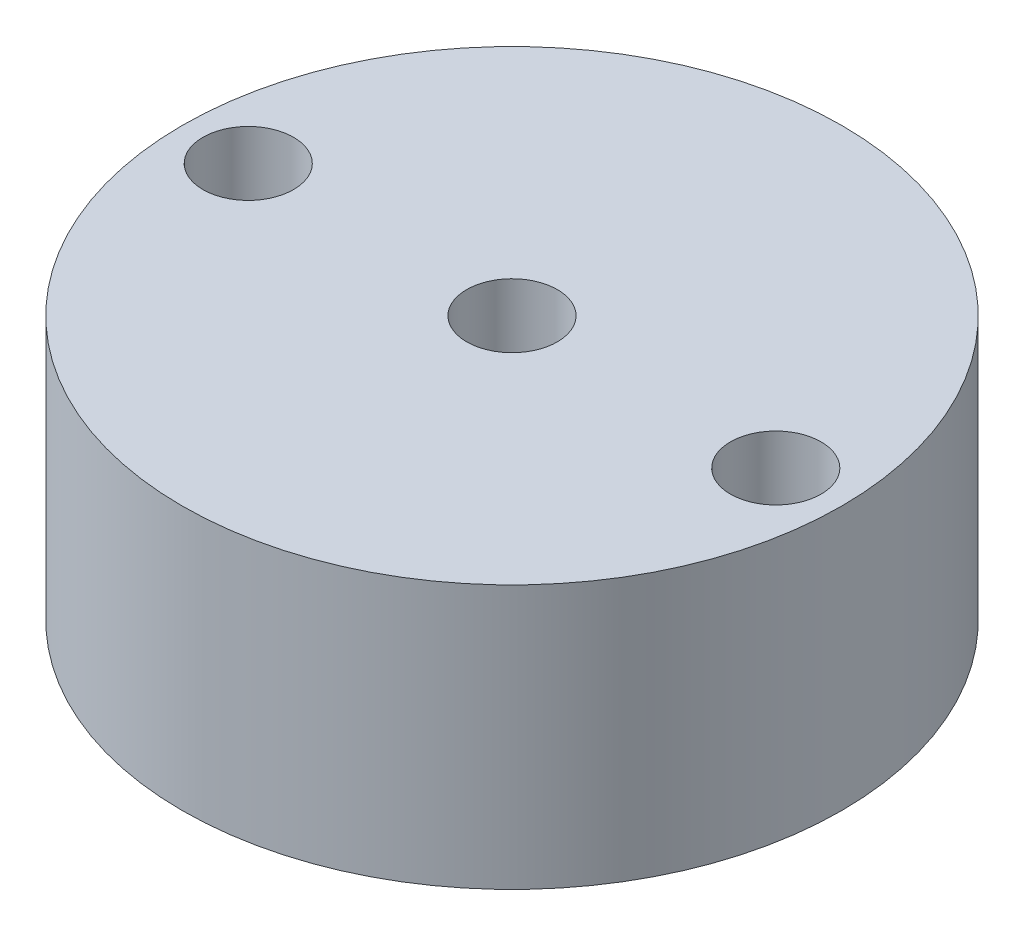
ISO-10303-21;
HEADER;
FILE_DESCRIPTION(('STEP AP214'),'2;1');
FILE_NAME('part.step','',(''),(''),'','','');
FILE_SCHEMA(('AUTOMOTIVE_DESIGN { 1 0 10303 214 1 1 1 1 }'));
ENDSEC;
DATA;
#1=APPLICATION_CONTEXT('core data for automotive mechanical design processes');
#2=APPLICATION_PROTOCOL_DEFINITION('international standard','automotive_design',2000,#1);
#3=PRODUCT_CONTEXT('',#1,'mechanical');
#4=PRODUCT('Part','Part','',(#3));
#5=PRODUCT_RELATED_PRODUCT_CATEGORY('part','',(#4));
#6=PRODUCT_DEFINITION_FORMATION('','',#4);
#7=PRODUCT_DEFINITION_CONTEXT('part definition',#1,'design');
#8=PRODUCT_DEFINITION('design','',#6,#7);
#9=PRODUCT_DEFINITION_SHAPE('','',#8);
#10=(LENGTH_UNIT() NAMED_UNIT(*) SI_UNIT(.MILLI.,.METRE.));
#11=(NAMED_UNIT(*) PLANE_ANGLE_UNIT() SI_UNIT($,.RADIAN.));
#12=(NAMED_UNIT(*) SI_UNIT($,.STERADIAN.) SOLID_ANGLE_UNIT());
#13=UNCERTAINTY_MEASURE_WITH_UNIT(LENGTH_MEASURE(1.E-05),#10,'distance_accuracy_value','');
#14=(GEOMETRIC_REPRESENTATION_CONTEXT(3) GLOBAL_UNCERTAINTY_ASSIGNED_CONTEXT((#13)) GLOBAL_UNIT_ASSIGNED_CONTEXT((#10,
#11,#12)) REPRESENTATION_CONTEXT('',''));
#15=CARTESIAN_POINT('',(0.,0.,0.));
#16=DIRECTION('',(0.,0.,1.));
#17=DIRECTION('',(1.,0.,0.));
#18=AXIS2_PLACEMENT_3D('',#15,#16,#17);
#19=CARTESIAN_POINT('',(0.,12.7,0.));
#20=DIRECTION('',(0.,1.,0.));
#21=DIRECTION('',(0.,0.,1.));
#22=AXIS2_PLACEMENT_3D('',#19,#20,#21);
#23=PLANE('',#22);
#24=CARTESIAN_POINT('',(12.7,12.7,0.));
#25=DIRECTION('',(0.,1.,0.));
#26=DIRECTION('',(0.,0.,1.));
#27=AXIS2_PLACEMENT_3D('',#24,#25,#26);
#28=CIRCLE('',#27,2.1828125);
#29=CARTESIAN_POINT('',(12.7,12.7,2.1828125));
#30=VERTEX_POINT('',#29);
#31=EDGE_CURVE('E56',#30,#30,#28,.T.);
#32=ORIENTED_EDGE('',*,*,#31,.F.);
#33=EDGE_LOOP('',(#32));
#34=FACE_BOUND('',#33,.T.);
#35=CARTESIAN_POINT('',(0.,12.7,0.));
#36=DIRECTION('',(0.,1.,0.));
#37=DIRECTION('',(0.,0.,1.));
#38=AXIS2_PLACEMENT_3D('',#35,#36,#37);
#39=CIRCLE('',#38,15.875);
#40=CARTESIAN_POINT('',(0.,12.7,15.875));
#41=VERTEX_POINT('',#40);
#42=EDGE_CURVE('E10',#41,#41,#39,.T.);
#43=ORIENTED_EDGE('',*,*,#42,.T.);
#44=EDGE_LOOP('',(#43));
#45=FACE_BOUND('',#44,.T.);
#46=CARTESIAN_POINT('',(0.,12.7,0.));
#47=DIRECTION('',(0.,1.,0.));
#48=DIRECTION('',(0.,0.,1.));
#49=AXIS2_PLACEMENT_3D('',#46,#47,#48);
#50=CIRCLE('',#49,2.1828125);
#51=CARTESIAN_POINT('',(0.,12.7,2.1828125));
#52=VERTEX_POINT('',#51);
#53=EDGE_CURVE('E50',#52,#52,#50,.T.);
#54=ORIENTED_EDGE('',*,*,#53,.F.);
#55=EDGE_LOOP('',(#54));
#56=FACE_BOUND('',#55,.T.);
#57=CARTESIAN_POINT('',(-12.7,12.7,0.));
#58=DIRECTION('',(0.,1.,0.));
#59=DIRECTION('',(0.,0.,1.));
#60=AXIS2_PLACEMENT_3D('',#57,#58,#59);
#61=CIRCLE('',#60,2.1828125);
#62=CARTESIAN_POINT('',(-12.7,12.7,2.1828125));
#63=VERTEX_POINT('',#62);
#64=EDGE_CURVE('E64',#63,#63,#61,.T.);
#65=ORIENTED_EDGE('',*,*,#64,.F.);
#66=EDGE_LOOP('',(#65));
#67=FACE_BOUND('',#66,.T.);
#68=ADVANCED_FACE('F37',(#34,#45,#56,#67),#23,.T.);
#69=CARTESIAN_POINT('',(0.,0.,0.));
#70=DIRECTION('',(0.,1.,0.));
#71=DIRECTION('',(0.,0.,1.));
#72=AXIS2_PLACEMENT_3D('',#69,#70,#71);
#73=PLANE('',#72);
#74=CARTESIAN_POINT('',(0.,0.,0.));
#75=DIRECTION('',(0.,1.,0.));
#76=DIRECTION('',(0.,0.,1.));
#77=AXIS2_PLACEMENT_3D('',#74,#75,#76);
#78=CIRCLE('',#77,15.875);
#79=CARTESIAN_POINT('',(0.,0.,15.875));
#80=VERTEX_POINT('',#79);
#81=EDGE_CURVE('E41',#80,#80,#78,.T.);
#82=ORIENTED_EDGE('',*,*,#81,.F.);
#83=EDGE_LOOP('',(#82));
#84=FACE_BOUND('',#83,.T.);
#85=CARTESIAN_POINT('',(0.,0.,0.));
#86=DIRECTION('',(0.,1.,0.));
#87=DIRECTION('',(0.,0.,1.));
#88=AXIS2_PLACEMENT_3D('',#85,#86,#87);
#89=CIRCLE('',#88,2.1828125);
#90=CARTESIAN_POINT('',(0.,0.,2.1828125));
#91=VERTEX_POINT('',#90);
#92=EDGE_CURVE('E52',#91,#91,#89,.T.);
#93=ORIENTED_EDGE('',*,*,#92,.T.);
#94=EDGE_LOOP('',(#93));
#95=FACE_BOUND('',#94,.T.);
#96=CARTESIAN_POINT('',(12.7,0.,0.));
#97=DIRECTION('',(0.,1.,0.));
#98=DIRECTION('',(0.,0.,1.));
#99=AXIS2_PLACEMENT_3D('',#96,#97,#98);
#100=CIRCLE('',#99,2.1828125);
#101=CARTESIAN_POINT('',(12.7,0.,2.1828125));
#102=VERTEX_POINT('',#101);
#103=EDGE_CURVE('E60',#102,#102,#100,.T.);
#104=ORIENTED_EDGE('',*,*,#103,.T.);
#105=EDGE_LOOP('',(#104));
#106=FACE_BOUND('',#105,.T.);
#107=CARTESIAN_POINT('',(-12.7,0.,0.));
#108=DIRECTION('',(0.,1.,0.));
#109=DIRECTION('',(0.,0.,1.));
#110=AXIS2_PLACEMENT_3D('',#107,#108,#109);
#111=CIRCLE('',#110,2.1828125);
#112=CARTESIAN_POINT('',(-12.7,0.,2.1828125));
#113=VERTEX_POINT('',#112);
#114=EDGE_CURVE('E68',#113,#113,#111,.T.);
#115=ORIENTED_EDGE('',*,*,#114,.T.);
#116=EDGE_LOOP('',(#115));
#117=FACE_BOUND('',#116,.T.);
#118=ADVANCED_FACE('F80',(#84,#95,#106,#117),#73,.F.);
#119=CARTESIAN_POINT('',(0.,12.7,0.));
#120=DIRECTION('',(0.,-1.,0.));
#121=DIRECTION('',(0.,0.,-1.));
#122=AXIS2_PLACEMENT_3D('',#119,#120,#121);
#123=CYLINDRICAL_SURFACE('',#122,15.875);
#124=ORIENTED_EDGE('',*,*,#42,.F.);
#125=EDGE_LOOP('',(#124));
#126=FACE_BOUND('',#125,.T.);
#127=ORIENTED_EDGE('',*,*,#81,.T.);
#128=EDGE_LOOP('',(#127));
#129=FACE_BOUND('',#128,.T.);
#130=ADVANCED_FACE('F39',(#126,#129),#123,.T.);
#131=CARTESIAN_POINT('',(0.,12.7,0.));
#132=DIRECTION('',(0.,-1.,0.));
#133=DIRECTION('',(0.,0.,-1.));
#134=AXIS2_PLACEMENT_3D('',#131,#132,#133);
#135=CYLINDRICAL_SURFACE('',#134,2.1828125);
#136=ORIENTED_EDGE('',*,*,#53,.T.);
#137=EDGE_LOOP('',(#136));
#138=FACE_BOUND('',#137,.T.);
#139=ORIENTED_EDGE('',*,*,#92,.F.);
#140=EDGE_LOOP('',(#139));
#141=FACE_BOUND('',#140,.T.);
#142=ADVANCED_FACE('F89',(#138,#141),#135,.F.);
#143=CARTESIAN_POINT('',(12.7,12.7,0.));
#144=DIRECTION('',(0.,-1.,0.));
#145=DIRECTION('',(0.,0.,-1.));
#146=AXIS2_PLACEMENT_3D('',#143,#144,#145);
#147=CYLINDRICAL_SURFACE('',#146,2.1828125);
#148=ORIENTED_EDGE('',*,*,#31,.T.);
#149=EDGE_LOOP('',(#148));
#150=FACE_BOUND('',#149,.T.);
#151=ORIENTED_EDGE('',*,*,#103,.F.);
#152=EDGE_LOOP('',(#151));
#153=FACE_BOUND('',#152,.T.);
#154=ADVANCED_FACE('F92',(#150,#153),#147,.F.);
#155=CARTESIAN_POINT('',(-12.7,12.7,0.));
#156=DIRECTION('',(0.,-1.,0.));
#157=DIRECTION('',(0.,0.,-1.));
#158=AXIS2_PLACEMENT_3D('',#155,#156,#157);
#159=CYLINDRICAL_SURFACE('',#158,2.1828125);
#160=ORIENTED_EDGE('',*,*,#64,.T.);
#161=EDGE_LOOP('',(#160));
#162=FACE_BOUND('',#161,.T.);
#163=ORIENTED_EDGE('',*,*,#114,.F.);
#164=EDGE_LOOP('',(#163));
#165=FACE_BOUND('',#164,.T.);
#166=ADVANCED_FACE('F76',(#162,#165),#159,.F.);
#167=CLOSED_SHELL('',(#68,#118,#130,#142,#154,#166));
#168=MANIFOLD_SOLID_BREP('B2',#167);
#169=ADVANCED_BREP_SHAPE_REPRESENTATION('',(#18,#168),#14);
#170=SHAPE_DEFINITION_REPRESENTATION(#9,#169);
ENDSEC;
END-ISO-10303-21;
